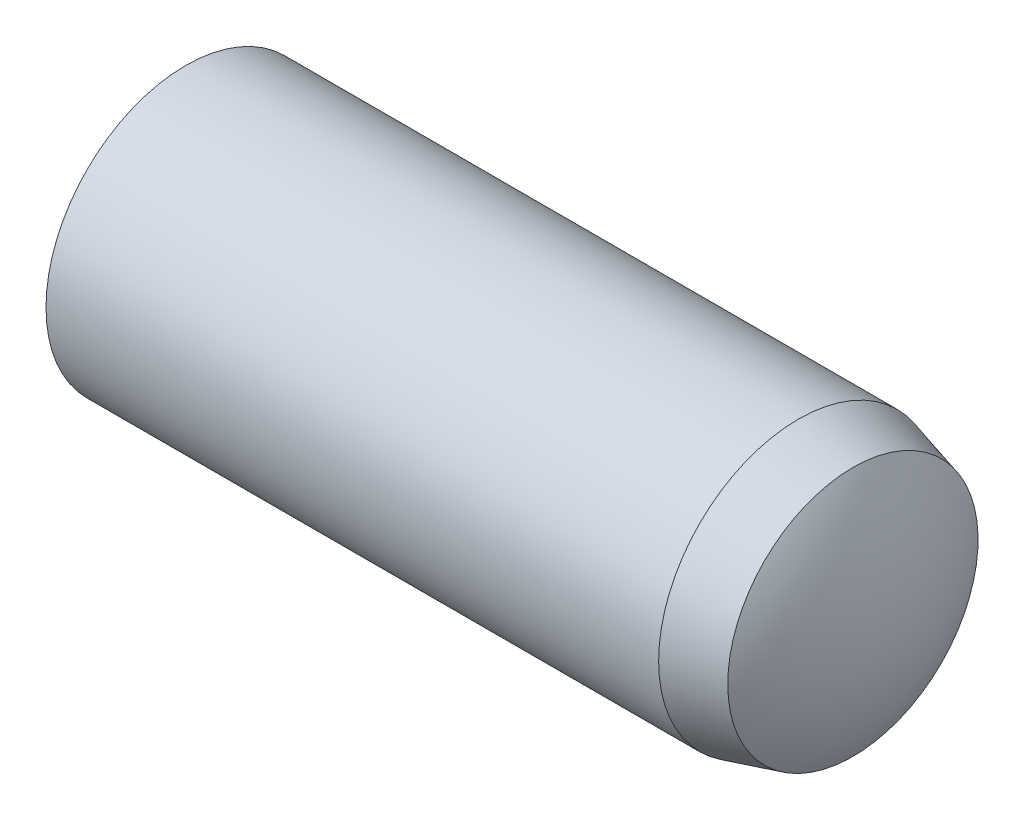
ISO-10303-21;
HEADER;
FILE_DESCRIPTION(('STEP AP214'),'2;1');
FILE_NAME('part.step','',(''),(''),'','','');
FILE_SCHEMA(('AUTOMOTIVE_DESIGN { 1 0 10303 214 1 1 1 1 }'));
ENDSEC;
DATA;
#1=APPLICATION_CONTEXT('core data for automotive mechanical design processes');
#2=APPLICATION_PROTOCOL_DEFINITION('international standard','automotive_design',2000,#1);
#3=PRODUCT_CONTEXT('',#1,'mechanical');
#4=PRODUCT('Part','Part','',(#3));
#5=PRODUCT_RELATED_PRODUCT_CATEGORY('part','',(#4));
#6=PRODUCT_DEFINITION_FORMATION('','',#4);
#7=PRODUCT_DEFINITION_CONTEXT('part definition',#1,'design');
#8=PRODUCT_DEFINITION('design','',#6,#7);
#9=PRODUCT_DEFINITION_SHAPE('','',#8);
#10=(LENGTH_UNIT() NAMED_UNIT(*) SI_UNIT(.MILLI.,.METRE.));
#11=(NAMED_UNIT(*) PLANE_ANGLE_UNIT() SI_UNIT($,.RADIAN.));
#12=(NAMED_UNIT(*) SI_UNIT($,.STERADIAN.) SOLID_ANGLE_UNIT());
#13=UNCERTAINTY_MEASURE_WITH_UNIT(LENGTH_MEASURE(1.E-05),#10,'distance_accuracy_value','');
#14=(GEOMETRIC_REPRESENTATION_CONTEXT(3) GLOBAL_UNCERTAINTY_ASSIGNED_CONTEXT((#13)) GLOBAL_UNIT_ASSIGNED_CONTEXT((#10,
#11,#12)) REPRESENTATION_CONTEXT('',''));
#15=CARTESIAN_POINT('',(0.,0.,0.));
#16=DIRECTION('',(0.,0.,1.));
#17=DIRECTION('',(1.,0.,0.));
#18=AXIS2_PLACEMENT_3D('',#15,#16,#17);
#19=CARTESIAN_POINT('',(-4.,0.,0.));
#20=DIRECTION('',(1.,0.,0.));
#21=DIRECTION('',(0.,0.,-1.00000000000001));
#22=AXIS2_PLACEMENT_3D('',#19,#20,#21);
#23=CYLINDRICAL_SURFACE('',#22,1.5);
#24=CARTESIAN_POINT('',(3.025,0.,0.));
#25=DIRECTION('',(-1.,0.,0.));
#26=DIRECTION('',(0.,0.,1.00000000000001));
#27=AXIS2_PLACEMENT_3D('',#24,#25,#26);
#28=CIRCLE('',#27,1.5);
#29=CARTESIAN_POINT('',(3.025,0.,1.50000000000003));
#30=VERTEX_POINT('',#29);
#31=EDGE_CURVE('E11',#30,#30,#28,.T.);
#32=ORIENTED_EDGE('',*,*,#31,.T.);
#33=EDGE_LOOP('',(#32));
#34=FACE_BOUND('',#33,.T.);
#35=CARTESIAN_POINT('',(-3.55,0.,0.));
#36=DIRECTION('',(-1.,0.,0.));
#37=DIRECTION('',(0.,0.,1.00000000000001));
#38=AXIS2_PLACEMENT_3D('',#35,#36,#37);
#39=CIRCLE('',#38,1.5);
#40=CARTESIAN_POINT('',(-3.55,0.,1.50000000000003));
#41=VERTEX_POINT('',#40);
#42=EDGE_CURVE('E56',#41,#41,#39,.T.);
#43=ORIENTED_EDGE('',*,*,#42,.F.);
#44=EDGE_LOOP('',(#43));
#45=FACE_BOUND('',#44,.T.);
#46=ADVANCED_FACE('F36',(#34,#45),#23,.T.);
#47=CARTESIAN_POINT('',(3.025,0.,0.));
#48=DIRECTION('',(-1.,0.,0.));
#49=DIRECTION('',(0.,0.,1.00000000000001));
#50=AXIS2_PLACEMENT_3D('',#47,#48,#49);
#51=CONICAL_SURFACE('',#50,1.5,0.26179938779915);
#52=CARTESIAN_POINT('',(3.61,0.,0.));
#53=DIRECTION('',(-1.,0.,0.));
#54=DIRECTION('',(0.,0.,1.00000000000001));
#55=AXIS2_PLACEMENT_3D('',#52,#53,#54);
#56=CIRCLE('',#55,1.34324972242779);
#57=CARTESIAN_POINT('',(3.61,0.,1.3432497224278));
#58=VERTEX_POINT('',#57);
#59=EDGE_CURVE('E43',#58,#58,#56,.T.);
#60=ORIENTED_EDGE('',*,*,#59,.T.);
#61=EDGE_LOOP('',(#60));
#62=FACE_BOUND('',#61,.T.);
#63=ORIENTED_EDGE('',*,*,#31,.F.);
#64=EDGE_LOOP('',(#63));
#65=FACE_BOUND('',#64,.T.);
#66=ADVANCED_FACE('F62',(#62,#65),#51,.T.);
#67=CARTESIAN_POINT('',(1.49176946563802,0.,0.));
#68=DIRECTION('',(-1.,0.,0.));
#69=DIRECTION('',(0.,0.999999999999998,0.));
#70=AXIS2_PLACEMENT_3D('',#67,#68,#69);
#71=SPHERICAL_SURFACE('',#70,2.50823053436198);
#72=CARTESIAN_POINT('',(4.,0.,0.));
#73=VERTEX_POINT('',#72);
#74=VERTEX_LOOP('',#73);
#75=FACE_BOUND('',#74,.T.);
#76=ORIENTED_EDGE('',*,*,#59,.F.);
#77=EDGE_LOOP('',(#76));
#78=FACE_BOUND('',#77,.T.);
#79=ADVANCED_FACE('F52',(#75,#78),#71,.T.);
#80=CARTESIAN_POINT('',(-1.275,0.,0.));
#81=DIRECTION('',(-1.,0.,0.));
#82=DIRECTION('',(0.,-0.999999999999998,0.));
#83=AXIS2_PLACEMENT_3D('',#80,#81,#82);
#84=SPHERICAL_SURFACE('',#83,2.725);
#85=CARTESIAN_POINT('',(-4.,0.,0.));
#86=VERTEX_POINT('',#85);
#87=VERTEX_LOOP('',#86);
#88=FACE_BOUND('',#87,.T.);
#89=ORIENTED_EDGE('',*,*,#42,.T.);
#90=EDGE_LOOP('',(#89));
#91=FACE_BOUND('',#90,.T.);
#92=ADVANCED_FACE('F49',(#88,#91),#84,.T.);
#93=CLOSED_SHELL('',(#46,#66,#79,#92));
#94=MANIFOLD_SOLID_BREP('B2',#93);
#95=ADVANCED_BREP_SHAPE_REPRESENTATION('',(#18,#94),#14);
#96=SHAPE_DEFINITION_REPRESENTATION(#9,#95);
ENDSEC;
END-ISO-10303-21;
